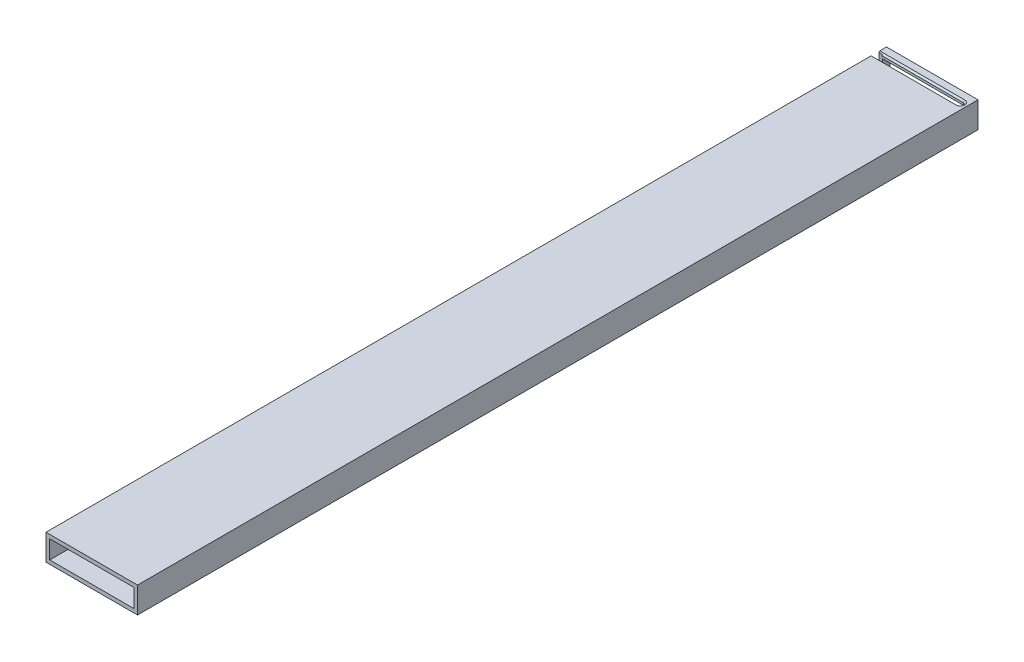
ISO-10303-21;
HEADER;
FILE_DESCRIPTION(('STEP AP214'),'2;1');
FILE_NAME('part.step','',(''),(''),'','','');
FILE_SCHEMA(('AUTOMOTIVE_DESIGN { 1 0 10303 214 1 1 1 1 }'));
ENDSEC;
DATA;
#1=APPLICATION_CONTEXT('core data for automotive mechanical design processes');
#2=APPLICATION_PROTOCOL_DEFINITION('international standard','automotive_design',2000,#1);
#3=PRODUCT_CONTEXT('',#1,'mechanical');
#4=PRODUCT('Part','Part','',(#3));
#5=PRODUCT_RELATED_PRODUCT_CATEGORY('part','',(#4));
#6=PRODUCT_DEFINITION_FORMATION('','',#4);
#7=PRODUCT_DEFINITION_CONTEXT('part definition',#1,'design');
#8=PRODUCT_DEFINITION('design','',#6,#7);
#9=PRODUCT_DEFINITION_SHAPE('','',#8);
#10=(LENGTH_UNIT() NAMED_UNIT(*) SI_UNIT(.MILLI.,.METRE.));
#11=(NAMED_UNIT(*) PLANE_ANGLE_UNIT() SI_UNIT($,.RADIAN.));
#12=(NAMED_UNIT(*) SI_UNIT($,.STERADIAN.) SOLID_ANGLE_UNIT());
#13=UNCERTAINTY_MEASURE_WITH_UNIT(LENGTH_MEASURE(1.E-05),#10,'distance_accuracy_value','');
#14=(GEOMETRIC_REPRESENTATION_CONTEXT(3) GLOBAL_UNCERTAINTY_ASSIGNED_CONTEXT((#13)) GLOBAL_UNIT_ASSIGNED_CONTEXT((#10,
#11,#12)) REPRESENTATION_CONTEXT('',''));
#15=CARTESIAN_POINT('',(0.,0.,0.));
#16=DIRECTION('',(0.,0.,1.));
#17=DIRECTION('',(1.,0.,0.));
#18=AXIS2_PLACEMENT_3D('',#15,#16,#17);
#19=CARTESIAN_POINT('',(-16.5,3.6,330.));
#20=DIRECTION('',(0.,-1.,0.));
#21=DIRECTION('',(0.,0.,-1.));
#22=AXIS2_PLACEMENT_3D('',#19,#20,#21);
#23=PLANE('',#22);
#24=DIRECTION('',(0.,0.,-1.));
#25=VECTOR('',#24,1.);
#26=CARTESIAN_POINT('',(-16.5,3.6,0.));
#27=LINE('',#26,#25);
#28=CARTESIAN_POINT('',(-16.5,3.6,3.24999999999998));
#29=VERTEX_POINT('',#28);
#30=CARTESIAN_POINT('',(-16.5,3.6,3.));
#31=VERTEX_POINT('',#30);
#32=EDGE_CURVE('E218',#29,#31,#27,.T.);
#33=ORIENTED_EDGE('',*,*,#32,.T.);
#34=DIRECTION('',(0.,0.,-1.));
#35=VECTOR('',#34,1.);
#36=CARTESIAN_POINT('',(-16.5,3.6,330.));
#37=LINE('',#36,#35);
#38=CARTESIAN_POINT('',(-16.5,3.6,0.));
#39=VERTEX_POINT('',#38);
#40=EDGE_CURVE('E288',#31,#39,#37,.T.);
#41=ORIENTED_EDGE('',*,*,#40,.T.);
#42=DIRECTION('',(-1.,0.,0.));
#43=VECTOR('',#42,1.);
#44=CARTESIAN_POINT('',(-16.5,3.6,0.));
#45=LINE('',#44,#43);
#46=CARTESIAN_POINT('',(16.5,3.6,0.));
#47=VERTEX_POINT('',#46);
#48=EDGE_CURVE('E271',#47,#39,#45,.T.);
#49=ORIENTED_EDGE('',*,*,#48,.F.);
#50=DIRECTION('',(0.,0.,-1.));
#51=VECTOR('',#50,1.);
#52=CARTESIAN_POINT('',(16.5,3.6,330.));
#53=LINE('',#52,#51);
#54=CARTESIAN_POINT('',(16.5,3.6,4.35000000000002));
#55=VERTEX_POINT('',#54);
#56=EDGE_CURVE('E204',#55,#47,#53,.T.);
#57=ORIENTED_EDGE('',*,*,#56,.F.);
#58=CARTESIAN_POINT('',(15.4,3.6,4.35000000000002));
#59=DIRECTION('',(0.,-1.,0.));
#60=DIRECTION('',(0.,0.,-1.));
#61=AXIS2_PLACEMENT_3D('',#58,#59,#60);
#62=CIRCLE('',#61,1.10000000000002);
#63=CARTESIAN_POINT('',(15.4,3.6,3.24999999999998));
#64=VERTEX_POINT('',#63);
#65=EDGE_CURVE('E190',#55,#64,#62,.F.);
#66=ORIENTED_EDGE('',*,*,#65,.T.);
#67=DIRECTION('',(1.,0.,0.));
#68=VECTOR('',#67,1.);
#69=CARTESIAN_POINT('',(0.,3.6,3.24999999999998));
#70=LINE('',#69,#68);
#71=EDGE_CURVE('E179',#29,#64,#70,.T.);
#72=ORIENTED_EDGE('',*,*,#71,.F.);
#73=EDGE_LOOP('',(#33,#41,#49,#57,#66,#72));
#74=FACE_BOUND('',#73,.T.);
#75=ADVANCED_FACE('F40',(#74),#23,.T.);
#76=CARTESIAN_POINT('',(-17.9659090909091,5.10000000000001,330.));
#77=DIRECTION('',(1.,0.,0.));
#78=DIRECTION('',(0.,0.,-1.));
#79=AXIS2_PLACEMENT_3D('',#76,#77,#78);
#80=PLANE('',#79);
#81=DIRECTION('',(0.,-1.,0.));
#82=VECTOR('',#81,1.);
#83=CARTESIAN_POINT('',(-17.9659090909091,0.,3.));
#84=LINE('',#83,#82);
#85=CARTESIAN_POINT('',(-17.9659090909091,4.75000000000003,3.));
#86=VERTEX_POINT('',#85);
#87=CARTESIAN_POINT('',(-17.9659090909091,0.399999999999996,3.));
#88=VERTEX_POINT('',#87);
#89=EDGE_CURVE('E237',#86,#88,#84,.T.);
#90=ORIENTED_EDGE('',*,*,#89,.F.);
#91=DIRECTION('',(0.,0.707106781186563,-0.707106781186532));
#92=VECTOR('',#91,1.);
#93=CARTESIAN_POINT('',(-17.9659090909091,5.10000000000001,2.65000000000004));
#94=LINE('',#93,#92);
#95=CARTESIAN_POINT('',(-17.9659090909091,5.10000000000001,2.65000000000004));
#96=VERTEX_POINT('',#95);
#97=EDGE_CURVE('E373',#86,#96,#94,.T.);
#98=ORIENTED_EDGE('',*,*,#97,.T.);
#99=DIRECTION('',(0.,0.,-1.));
#100=VECTOR('',#99,1.);
#101=CARTESIAN_POINT('',(-17.9659090909091,5.10000000000001,330.));
#102=LINE('',#101,#100);
#103=CARTESIAN_POINT('',(-17.9659090909091,5.10000000000001,0.));
#104=VERTEX_POINT('',#103);
#105=EDGE_CURVE('E331',#96,#104,#102,.T.);
#106=ORIENTED_EDGE('',*,*,#105,.T.);
#107=DIRECTION('',(0.,-1.,0.));
#108=VECTOR('',#107,1.);
#109=CARTESIAN_POINT('',(-17.9659090909091,5.10000000000001,0.));
#110=LINE('',#109,#108);
#111=CARTESIAN_POINT('',(-17.9659090909091,-5.1,0.));
#112=VERTEX_POINT('',#111);
#113=EDGE_CURVE('E319',#104,#112,#110,.T.);
#114=ORIENTED_EDGE('',*,*,#113,.T.);
#115=DIRECTION('',(0.,0.,-1.));
#116=VECTOR('',#115,1.);
#117=CARTESIAN_POINT('',(-17.9659090909091,-5.1,330.));
#118=LINE('',#117,#116);
#119=CARTESIAN_POINT('',(-17.9659090909091,-5.1,330.));
#120=VERTEX_POINT('',#119);
#121=EDGE_CURVE('E327',#120,#112,#118,.T.);
#122=ORIENTED_EDGE('',*,*,#121,.F.);
#123=DIRECTION('',(0.,-1.,0.));
#124=VECTOR('',#123,1.);
#125=CARTESIAN_POINT('',(-17.9659090909091,5.10000000000001,330.));
#126=LINE('',#125,#124);
#127=CARTESIAN_POINT('',(-17.9659090909091,5.10000000000001,330.));
#128=VERTEX_POINT('',#127);
#129=EDGE_CURVE('E305',#128,#120,#126,.T.);
#130=ORIENTED_EDGE('',*,*,#129,.F.);
#131=CARTESIAN_POINT('',(-17.9659090909091,5.10000000000001,6.05000000000006));
#132=VERTEX_POINT('',#131);
#133=EDGE_CURVE('E332',#128,#132,#102,.T.);
#134=ORIENTED_EDGE('',*,*,#133,.T.);
#135=DIRECTION('',(0.,-0.707106781186523,-0.707106781186572));
#136=VECTOR('',#135,1.);
#137=CARTESIAN_POINT('',(-17.9659090909091,5.10000000000001,6.05000000000006));
#138=LINE('',#137,#136);
#139=CARTESIAN_POINT('',(-17.9659090909091,4.74999999999998,5.7));
#140=VERTEX_POINT('',#139);
#141=EDGE_CURVE('E370',#132,#140,#138,.T.);
#142=ORIENTED_EDGE('',*,*,#141,.T.);
#143=DIRECTION('',(0.,-1.,0.));
#144=VECTOR('',#143,1.);
#145=CARTESIAN_POINT('',(-17.9659090909091,0.,5.7));
#146=LINE('',#145,#144);
#147=CARTESIAN_POINT('',(-17.9659090909091,0.399999999999998,5.69999999999998));
#148=VERTEX_POINT('',#147);
#149=EDGE_CURVE('E234',#140,#148,#146,.T.);
#150=ORIENTED_EDGE('',*,*,#149,.T.);
#151=DIRECTION('',(0.,0.,1.));
#152=VECTOR('',#151,1.);
#153=CARTESIAN_POINT('',(-17.9659090909091,0.399999999999994,0.));
#154=LINE('',#153,#152);
#155=EDGE_CURVE('E240',#88,#148,#154,.T.);
#156=ORIENTED_EDGE('',*,*,#155,.F.);
#157=EDGE_LOOP('',(#90,#98,#106,#114,#122,#130,#134,#142,#150,#156));
#158=FACE_BOUND('',#157,.T.);
#159=ADVANCED_FACE('F403',(#158),#80,.F.);
#160=CARTESIAN_POINT('',(0.,0.,330.));
#161=DIRECTION('',(0.,0.,1.));
#162=DIRECTION('',(1.,0.,0.));
#163=AXIS2_PLACEMENT_3D('',#160,#161,#162);
#164=PLANE('',#163);
#165=DIRECTION('',(0.,1.,0.));
#166=VECTOR('',#165,1.);
#167=CARTESIAN_POINT('',(17.9659090909091,5.10000000000001,330.));
#168=LINE('',#167,#166);
#169=CARTESIAN_POINT('',(17.9659090909091,-5.1,330.));
#170=VERTEX_POINT('',#169);
#171=CARTESIAN_POINT('',(17.9659090909091,5.10000000000001,330.));
#172=VERTEX_POINT('',#171);
#173=EDGE_CURVE('E297',#170,#172,#168,.T.);
#174=ORIENTED_EDGE('',*,*,#173,.T.);
#175=DIRECTION('',(-1.,0.,0.));
#176=VECTOR('',#175,1.);
#177=CARTESIAN_POINT('',(-17.9659090909091,5.10000000000001,330.));
#178=LINE('',#177,#176);
#179=EDGE_CURVE('E301',#172,#128,#178,.T.);
#180=ORIENTED_EDGE('',*,*,#179,.T.);
#181=ORIENTED_EDGE('',*,*,#129,.T.);
#182=DIRECTION('',(1.,0.,0.));
#183=VECTOR('',#182,1.);
#184=CARTESIAN_POINT('',(-17.9659090909091,-5.1,330.));
#185=LINE('',#184,#183);
#186=EDGE_CURVE('E308',#120,#170,#185,.T.);
#187=ORIENTED_EDGE('',*,*,#186,.T.);
#188=EDGE_LOOP('',(#174,#180,#181,#187));
#189=FACE_BOUND('',#188,.T.);
#190=DIRECTION('',(-1.,0.,0.));
#191=VECTOR('',#190,1.);
#192=CARTESIAN_POINT('',(-16.5,3.6,330.));
#193=LINE('',#192,#191);
#194=CARTESIAN_POINT('',(16.5,3.6,330.));
#195=VERTEX_POINT('',#194);
#196=CARTESIAN_POINT('',(-16.5,3.6,330.));
#197=VERTEX_POINT('',#196);
#198=EDGE_CURVE('E256',#195,#197,#193,.T.);
#199=ORIENTED_EDGE('',*,*,#198,.F.);
#200=DIRECTION('',(0.,1.,0.));
#201=VECTOR('',#200,1.);
#202=CARTESIAN_POINT('',(16.5,3.6,330.));
#203=LINE('',#202,#201);
#204=CARTESIAN_POINT('',(16.5,-3.6,330.));
#205=VERTEX_POINT('',#204);
#206=EDGE_CURVE('E253',#205,#195,#203,.T.);
#207=ORIENTED_EDGE('',*,*,#206,.F.);
#208=DIRECTION('',(1.,0.,0.));
#209=VECTOR('',#208,1.);
#210=CARTESIAN_POINT('',(-16.5,-3.6,330.));
#211=LINE('',#210,#209);
#212=CARTESIAN_POINT('',(-16.5,-3.6,330.));
#213=VERTEX_POINT('',#212);
#214=EDGE_CURVE('E264',#213,#205,#211,.T.);
#215=ORIENTED_EDGE('',*,*,#214,.F.);
#216=DIRECTION('',(0.,-1.,0.));
#217=VECTOR('',#216,1.);
#218=CARTESIAN_POINT('',(-16.5,3.6,330.));
#219=LINE('',#218,#217);
#220=EDGE_CURVE('E260',#197,#213,#219,.T.);
#221=ORIENTED_EDGE('',*,*,#220,.F.);
#222=EDGE_LOOP('',(#199,#207,#215,#221));
#223=FACE_BOUND('',#222,.T.);
#224=ADVANCED_FACE('F407',(#189,#223),#164,.T.);
#225=CARTESIAN_POINT('',(0.,0.,0.));
#226=DIRECTION('',(0.,0.,1.));
#227=DIRECTION('',(1.,0.,0.));
#228=AXIS2_PLACEMENT_3D('',#225,#226,#227);
#229=PLANE('',#228);
#230=DIRECTION('',(0.,1.,0.));
#231=VECTOR('',#230,1.);
#232=CARTESIAN_POINT('',(17.9659090909091,5.10000000000001,0.));
#233=LINE('',#232,#231);
#234=CARTESIAN_POINT('',(17.9659090909091,-5.1,0.));
#235=VERTEX_POINT('',#234);
#236=CARTESIAN_POINT('',(17.9659090909091,5.10000000000001,0.));
#237=VERTEX_POINT('',#236);
#238=EDGE_CURVE('E296',#235,#237,#233,.T.);
#239=ORIENTED_EDGE('',*,*,#238,.F.);
#240=DIRECTION('',(1.,0.,0.));
#241=VECTOR('',#240,1.);
#242=CARTESIAN_POINT('',(-17.9659090909091,-5.1,0.));
#243=LINE('',#242,#241);
#244=EDGE_CURVE('E302',#112,#235,#243,.T.);
#245=ORIENTED_EDGE('',*,*,#244,.F.);
#246=ORIENTED_EDGE('',*,*,#113,.F.);
#247=DIRECTION('',(-1.,0.,0.));
#248=VECTOR('',#247,1.);
#249=CARTESIAN_POINT('',(-17.9659090909091,5.10000000000001,0.));
#250=LINE('',#249,#248);
#251=EDGE_CURVE('E315',#237,#104,#250,.T.);
#252=ORIENTED_EDGE('',*,*,#251,.F.);
#253=EDGE_LOOP('',(#239,#245,#246,#252));
#254=FACE_BOUND('',#253,.T.);
#255=DIRECTION('',(0.,1.,0.));
#256=VECTOR('',#255,1.);
#257=CARTESIAN_POINT('',(16.5,3.6,0.));
#258=LINE('',#257,#256);
#259=CARTESIAN_POINT('',(16.5,-3.6,0.));
#260=VERTEX_POINT('',#259);
#261=EDGE_CURVE('E249',#260,#47,#258,.T.);
#262=ORIENTED_EDGE('',*,*,#261,.T.);
#263=ORIENTED_EDGE('',*,*,#48,.T.);
#264=DIRECTION('',(0.,-1.,0.));
#265=VECTOR('',#264,1.);
#266=CARTESIAN_POINT('',(-16.5,3.6,0.));
#267=LINE('',#266,#265);
#268=CARTESIAN_POINT('',(-16.5,-3.6,0.));
#269=VERTEX_POINT('',#268);
#270=EDGE_CURVE('E275',#39,#269,#267,.T.);
#271=ORIENTED_EDGE('',*,*,#270,.T.);
#272=DIRECTION('',(1.,0.,0.));
#273=VECTOR('',#272,1.);
#274=CARTESIAN_POINT('',(-16.5,-3.6,0.));
#275=LINE('',#274,#273);
#276=EDGE_CURVE('E257',#269,#260,#275,.T.);
#277=ORIENTED_EDGE('',*,*,#276,.T.);
#278=EDGE_LOOP('',(#262,#263,#271,#277));
#279=FACE_BOUND('',#278,.T.);
#280=ADVANCED_FACE('F418',(#254,#279),#229,.F.);
#281=CARTESIAN_POINT('',(17.9659090909091,5.10000000000001,330.));
#282=DIRECTION('',(-1.,0.,0.));
#283=DIRECTION('',(0.,-1.,0.));
#284=AXIS2_PLACEMENT_3D('',#281,#282,#283);
#285=PLANE('',#284);
#286=ORIENTED_EDGE('',*,*,#238,.T.);
#287=DIRECTION('',(0.,0.,-1.));
#288=VECTOR('',#287,1.);
#289=CARTESIAN_POINT('',(17.9659090909091,5.10000000000001,330.));
#290=LINE('',#289,#288);
#291=EDGE_CURVE('E336',#172,#237,#290,.T.);
#292=ORIENTED_EDGE('',*,*,#291,.F.);
#293=ORIENTED_EDGE('',*,*,#173,.F.);
#294=DIRECTION('',(0.,0.,-1.));
#295=VECTOR('',#294,1.);
#296=CARTESIAN_POINT('',(17.9659090909091,-5.1,330.));
#297=LINE('',#296,#295);
#298=EDGE_CURVE('E311',#170,#235,#297,.T.);
#299=ORIENTED_EDGE('',*,*,#298,.T.);
#300=EDGE_LOOP('',(#286,#292,#293,#299));
#301=FACE_BOUND('',#300,.T.);
#302=ADVANCED_FACE('F415',(#301),#285,.F.);
#303=CARTESIAN_POINT('',(-17.9659090909091,5.10000000000001,330.));
#304=DIRECTION('',(0.,-1.,0.));
#305=DIRECTION('',(0.,0.,-1.));
#306=AXIS2_PLACEMENT_3D('',#303,#304,#305);
#307=PLANE('',#306);
#308=ORIENTED_EDGE('',*,*,#105,.F.);
#309=DIRECTION('',(1.,0.,0.));
#310=VECTOR('',#309,1.);
#311=CARTESIAN_POINT('',(15.4,5.10000000000001,2.65000000000005));
#312=LINE('',#311,#310);
#313=CARTESIAN_POINT('',(15.4,5.10000000000001,2.64999999999998));
#314=VERTEX_POINT('',#313);
#315=EDGE_CURVE('E357',#96,#314,#312,.T.);
#316=ORIENTED_EDGE('',*,*,#315,.T.);
#317=CARTESIAN_POINT('',(15.4,5.10000000000001,4.35000000000002));
#318=DIRECTION('',(0.,-1.,0.));
#319=DIRECTION('',(0.,0.,-1.));
#320=AXIS2_PLACEMENT_3D('',#317,#318,#319);
#321=CIRCLE('',#320,1.70000000000004);
#322=CARTESIAN_POINT('',(15.4,5.10000000000001,6.05000000000005));
#323=VERTEX_POINT('',#322);
#324=EDGE_CURVE('E354',#314,#323,#321,.T.);
#325=ORIENTED_EDGE('',*,*,#324,.T.);
#326=DIRECTION('',(-1.,0.,0.));
#327=VECTOR('',#326,1.);
#328=CARTESIAN_POINT('',(-16.5,5.10000000000001,6.05000000000006));
#329=LINE('',#328,#327);
#330=EDGE_CURVE('E351',#323,#132,#329,.T.);
#331=ORIENTED_EDGE('',*,*,#330,.T.);
#332=ORIENTED_EDGE('',*,*,#133,.F.);
#333=ORIENTED_EDGE('',*,*,#179,.F.);
#334=ORIENTED_EDGE('',*,*,#291,.T.);
#335=ORIENTED_EDGE('',*,*,#251,.T.);
#336=EDGE_LOOP('',(#308,#316,#325,#331,#332,#333,#334,#335));
#337=FACE_BOUND('',#336,.T.);
#338=ADVANCED_FACE('F399',(#337),#307,.F.);
#339=CARTESIAN_POINT('',(-17.9659090909091,-5.1,330.));
#340=DIRECTION('',(0.,1.,0.));
#341=DIRECTION('',(-1.,0.,0.));
#342=AXIS2_PLACEMENT_3D('',#339,#340,#341);
#343=PLANE('',#342);
#344=ORIENTED_EDGE('',*,*,#244,.T.);
#345=ORIENTED_EDGE('',*,*,#298,.F.);
#346=ORIENTED_EDGE('',*,*,#186,.F.);
#347=ORIENTED_EDGE('',*,*,#121,.T.);
#348=EDGE_LOOP('',(#344,#345,#346,#347));
#349=FACE_BOUND('',#348,.T.);
#350=ADVANCED_FACE('F421',(#349),#343,.F.);
#351=CARTESIAN_POINT('',(16.5,3.6,330.));
#352=DIRECTION('',(-1.,0.,0.));
#353=DIRECTION('',(0.,-1.,0.));
#354=AXIS2_PLACEMENT_3D('',#351,#352,#353);
#355=PLANE('',#354);
#356=EDGE_CURVE('E293',#195,#55,#53,.T.);
#357=ORIENTED_EDGE('',*,*,#356,.T.);
#358=ORIENTED_EDGE('',*,*,#56,.T.);
#359=ORIENTED_EDGE('',*,*,#261,.F.);
#360=DIRECTION('',(0.,0.,-1.));
#361=VECTOR('',#360,1.);
#362=CARTESIAN_POINT('',(16.5,-3.6,330.));
#363=LINE('',#362,#361);
#364=EDGE_CURVE('E267',#205,#260,#363,.T.);
#365=ORIENTED_EDGE('',*,*,#364,.F.);
#366=ORIENTED_EDGE('',*,*,#206,.T.);
#367=EDGE_LOOP('',(#357,#358,#359,#365,#366));
#368=FACE_BOUND('',#367,.T.);
#369=ADVANCED_FACE('F423',(#368),#355,.T.);
#370=CARTESIAN_POINT('',(15.4,3.6,5.45000000000004));
#371=VERTEX_POINT('',#370);
#372=EDGE_CURVE('E200',#371,#55,#62,.F.);
#373=ORIENTED_EDGE('',*,*,#372,.T.);
#374=ORIENTED_EDGE('',*,*,#356,.F.);
#375=ORIENTED_EDGE('',*,*,#198,.T.);
#376=CARTESIAN_POINT('',(-16.5,3.6,5.69999999999998));
#377=VERTEX_POINT('',#376);
#378=EDGE_CURVE('E289',#197,#377,#37,.T.);
#379=ORIENTED_EDGE('',*,*,#378,.T.);
#380=DIRECTION('',(0.,0.,-1.));
#381=VECTOR('',#380,1.);
#382=CARTESIAN_POINT('',(-16.5,3.6,0.));
#383=LINE('',#382,#381);
#384=CARTESIAN_POINT('',(-16.5,3.6,5.45000000000002));
#385=VERTEX_POINT('',#384);
#386=EDGE_CURVE('E212',#377,#385,#383,.T.);
#387=ORIENTED_EDGE('',*,*,#386,.T.);
#388=DIRECTION('',(-1.,0.,0.));
#389=VECTOR('',#388,1.);
#390=CARTESIAN_POINT('',(0.,3.6,5.45000000000002));
#391=LINE('',#390,#389);
#392=EDGE_CURVE('E191',#371,#385,#391,.T.);
#393=ORIENTED_EDGE('',*,*,#392,.F.);
#394=EDGE_LOOP('',(#373,#374,#375,#379,#387,#393));
#395=FACE_BOUND('',#394,.T.);
#396=ADVANCED_FACE('F429',(#395),#23,.T.);
#397=CARTESIAN_POINT('',(-16.5,3.6,330.));
#398=DIRECTION('',(1.,0.,0.));
#399=DIRECTION('',(0.,1.,0.));
#400=AXIS2_PLACEMENT_3D('',#397,#398,#399);
#401=PLANE('',#400);
#402=DIRECTION('',(0.,1.,0.));
#403=VECTOR('',#402,1.);
#404=CARTESIAN_POINT('',(-16.5,3.6,3.));
#405=LINE('',#404,#403);
#406=CARTESIAN_POINT('',(-16.5,0.399999999999996,3.));
#407=VERTEX_POINT('',#406);
#408=EDGE_CURVE('E347',#407,#31,#405,.T.);
#409=ORIENTED_EDGE('',*,*,#408,.F.);
#410=DIRECTION('',(0.,0.,-1.));
#411=VECTOR('',#410,1.);
#412=CARTESIAN_POINT('',(-16.5,0.400000000000259,330.));
#413=LINE('',#412,#411);
#414=CARTESIAN_POINT('',(-16.5,0.399999999999998,5.7));
#415=VERTEX_POINT('',#414);
#416=EDGE_CURVE('E344',#415,#407,#413,.T.);
#417=ORIENTED_EDGE('',*,*,#416,.F.);
#418=DIRECTION('',(0.,1.,0.));
#419=VECTOR('',#418,1.);
#420=CARTESIAN_POINT('',(-16.5,3.6,5.69999999999998));
#421=LINE('',#420,#419);
#422=EDGE_CURVE('E340',#415,#377,#421,.T.);
#423=ORIENTED_EDGE('',*,*,#422,.T.);
#424=ORIENTED_EDGE('',*,*,#378,.F.);
#425=ORIENTED_EDGE('',*,*,#220,.T.);
#426=DIRECTION('',(0.,0.,-1.));
#427=VECTOR('',#426,1.);
#428=CARTESIAN_POINT('',(-16.5,-3.6,330.));
#429=LINE('',#428,#427);
#430=EDGE_CURVE('E285',#213,#269,#429,.T.);
#431=ORIENTED_EDGE('',*,*,#430,.T.);
#432=ORIENTED_EDGE('',*,*,#270,.F.);
#433=ORIENTED_EDGE('',*,*,#40,.F.);
#434=EDGE_LOOP('',(#409,#417,#423,#424,#425,#431,#432,#433));
#435=FACE_BOUND('',#434,.T.);
#436=ADVANCED_FACE('F444',(#435),#401,.T.);
#437=CARTESIAN_POINT('',(-16.5,-3.6,330.));
#438=DIRECTION('',(0.,1.,0.));
#439=DIRECTION('',(0.,0.,1.));
#440=AXIS2_PLACEMENT_3D('',#437,#438,#439);
#441=PLANE('',#440);
#442=ORIENTED_EDGE('',*,*,#276,.F.);
#443=ORIENTED_EDGE('',*,*,#430,.F.);
#444=ORIENTED_EDGE('',*,*,#214,.T.);
#445=ORIENTED_EDGE('',*,*,#364,.T.);
#446=EDGE_LOOP('',(#442,#443,#444,#445));
#447=FACE_BOUND('',#446,.T.);
#448=ADVANCED_FACE('F449',(#447),#441,.T.);
#449=CARTESIAN_POINT('',(20.6868842830917,0.,3.));
#450=DIRECTION('',(0.,0.,-1.));
#451=DIRECTION('',(-1.,0.,0.));
#452=AXIS2_PLACEMENT_3D('',#449,#450,#451);
#453=PLANE('',#452);
#454=DIRECTION('',(0.,1.,0.));
#455=VECTOR('',#454,1.);
#456=CARTESIAN_POINT('',(-16.5,-30.9715040092677,3.));
#457=LINE('',#456,#455);
#458=CARTESIAN_POINT('',(-16.5,4.75000000000003,3.));
#459=VERTEX_POINT('',#458);
#460=EDGE_CURVE('E220',#31,#459,#457,.T.);
#461=ORIENTED_EDGE('',*,*,#460,.T.);
#462=DIRECTION('',(-1.,0.,0.));
#463=VECTOR('',#462,1.);
#464=CARTESIAN_POINT('',(-17.9659090909091,4.75000000000003,3.));
#465=LINE('',#464,#463);
#466=EDGE_CURVE('E367',#459,#86,#465,.T.);
#467=ORIENTED_EDGE('',*,*,#466,.T.);
#468=ORIENTED_EDGE('',*,*,#89,.T.);
#469=DIRECTION('',(-1.,0.,0.));
#470=VECTOR('',#469,1.);
#471=CARTESIAN_POINT('',(20.6868842830917,0.399999999999996,3.));
#472=LINE('',#471,#470);
#473=EDGE_CURVE('E244',#407,#88,#472,.T.);
#474=ORIENTED_EDGE('',*,*,#473,.F.);
#475=ORIENTED_EDGE('',*,*,#408,.T.);
#476=EDGE_LOOP('',(#461,#467,#468,#474,#475));
#477=FACE_BOUND('',#476,.T.);
#478=ADVANCED_FACE('F476',(#477),#453,.F.);
#479=CARTESIAN_POINT('',(20.6868842830917,0.399999999999994,0.));
#480=DIRECTION('',(0.,-1.,0.));
#481=DIRECTION('',(0.,0.,-1.));
#482=AXIS2_PLACEMENT_3D('',#479,#480,#481);
#483=PLANE('',#482);
#484=ORIENTED_EDGE('',*,*,#416,.T.);
#485=ORIENTED_EDGE('',*,*,#473,.T.);
#486=ORIENTED_EDGE('',*,*,#155,.T.);
#487=DIRECTION('',(-1.,0.,0.));
#488=VECTOR('',#487,1.);
#489=CARTESIAN_POINT('',(20.6868842830917,0.399999999999998,5.7));
#490=LINE('',#489,#488);
#491=EDGE_CURVE('E245',#415,#148,#490,.T.);
#492=ORIENTED_EDGE('',*,*,#491,.F.);
#493=EDGE_LOOP('',(#484,#485,#486,#492));
#494=FACE_BOUND('',#493,.T.);
#495=ADVANCED_FACE('F480',(#494),#483,.F.);
#496=CARTESIAN_POINT('',(20.6868842830917,0.,5.7));
#497=DIRECTION('',(0.,0.,-1.));
#498=DIRECTION('',(-1.,0.,0.));
#499=AXIS2_PLACEMENT_3D('',#496,#497,#498);
#500=PLANE('',#499);
#501=ORIENTED_EDGE('',*,*,#149,.F.);
#502=DIRECTION('',(1.,0.,0.));
#503=VECTOR('',#502,1.);
#504=CARTESIAN_POINT('',(20.6868842830917,4.74999999999998,5.7));
#505=LINE('',#504,#503);
#506=CARTESIAN_POINT('',(-16.5,4.74999999999998,5.7));
#507=VERTEX_POINT('',#506);
#508=EDGE_CURVE('E66',#140,#507,#505,.T.);
#509=ORIENTED_EDGE('',*,*,#508,.T.);
#510=DIRECTION('',(0.,1.,0.));
#511=VECTOR('',#510,1.);
#512=CARTESIAN_POINT('',(-16.5,-30.9715040092677,5.7));
#513=LINE('',#512,#511);
#514=EDGE_CURVE('E217',#377,#507,#513,.T.);
#515=ORIENTED_EDGE('',*,*,#514,.F.);
#516=ORIENTED_EDGE('',*,*,#422,.F.);
#517=ORIENTED_EDGE('',*,*,#491,.T.);
#518=EDGE_LOOP('',(#501,#509,#515,#516,#517));
#519=FACE_BOUND('',#518,.T.);
#520=ADVANCED_FACE('F483',(#519),#500,.T.);
#521=CARTESIAN_POINT('',(15.4,-30.9715040092677,4.35000000000002));
#522=DIRECTION('',(0.,1.,0.));
#523=DIRECTION('',(0.,0.,1.));
#524=AXIS2_PLACEMENT_3D('',#521,#522,#523);
#525=CYLINDRICAL_SURFACE('',#524,1.10000000000002);
#526=DIRECTION('',(0.,1.,0.));
#527=VECTOR('',#526,1.);
#528=CARTESIAN_POINT('',(15.4,-30.9715040092677,5.45000000000002));
#529=LINE('',#528,#527);
#530=CARTESIAN_POINT('',(15.4,4.50000000000002,5.45000000000002));
#531=VERTEX_POINT('',#530);
#532=EDGE_CURVE('E224',#371,#531,#529,.T.);
#533=ORIENTED_EDGE('',*,*,#532,.T.);
#534=CARTESIAN_POINT('',(15.4,4.50000000000002,4.35000000000002));
#535=DIRECTION('',(0.,-1.,0.));
#536=DIRECTION('',(0.,0.,-1.));
#537=AXIS2_PLACEMENT_3D('',#534,#535,#536);
#538=CIRCLE('',#537,1.10000000000002);
#539=CARTESIAN_POINT('',(15.4,4.50000000000002,3.24999999999998));
#540=VERTEX_POINT('',#539);
#541=EDGE_CURVE('E198',#531,#540,#538,.F.);
#542=ORIENTED_EDGE('',*,*,#541,.T.);
#543=DIRECTION('',(0.,1.,0.));
#544=VECTOR('',#543,1.);
#545=CARTESIAN_POINT('',(15.4,-30.9715040092677,3.24999999999998));
#546=LINE('',#545,#544);
#547=EDGE_CURVE('E182',#64,#540,#546,.T.);
#548=ORIENTED_EDGE('',*,*,#547,.F.);
#549=ORIENTED_EDGE('',*,*,#65,.F.);
#550=ORIENTED_EDGE('',*,*,#372,.F.);
#551=EDGE_LOOP('',(#533,#542,#548,#549,#550));
#552=FACE_BOUND('',#551,.T.);
#553=ADVANCED_FACE('F195',(#552),#525,.F.);
#554=CARTESIAN_POINT('',(0.,-30.9715040092677,3.24999999999998));
#555=DIRECTION('',(0.,0.,1.));
#556=DIRECTION('',(1.,0.,0.));
#557=AXIS2_PLACEMENT_3D('',#554,#555,#556);
#558=PLANE('',#557);
#559=ORIENTED_EDGE('',*,*,#547,.T.);
#560=DIRECTION('',(-1.,0.,0.));
#561=VECTOR('',#560,1.);
#562=CARTESIAN_POINT('',(-16.5,4.50000000000005,3.24999999999998));
#563=LINE('',#562,#561);
#564=CARTESIAN_POINT('',(-16.5,4.50000000000005,3.24999999999998));
#565=VERTEX_POINT('',#564);
#566=EDGE_CURVE('E361',#540,#565,#563,.T.);
#567=ORIENTED_EDGE('',*,*,#566,.T.);
#568=DIRECTION('',(0.,1.,0.));
#569=VECTOR('',#568,1.);
#570=CARTESIAN_POINT('',(-16.5,-30.9715040092677,3.24999999999998));
#571=LINE('',#570,#569);
#572=EDGE_CURVE('E185',#29,#565,#571,.T.);
#573=ORIENTED_EDGE('',*,*,#572,.F.);
#574=ORIENTED_EDGE('',*,*,#71,.T.);
#575=EDGE_LOOP('',(#559,#567,#573,#574));
#576=FACE_BOUND('',#575,.T.);
#577=ADVANCED_FACE('F181',(#576),#558,.T.);
#578=CARTESIAN_POINT('',(-16.5,-30.9715040092677,0.));
#579=DIRECTION('',(1.,0.,0.));
#580=DIRECTION('',(0.,0.,-1.));
#581=AXIS2_PLACEMENT_3D('',#578,#579,#580);
#582=PLANE('',#581);
#583=ORIENTED_EDGE('',*,*,#572,.T.);
#584=DIRECTION('',(0.,0.707106781186563,-0.707106781186532));
#585=VECTOR('',#584,1.);
#586=CARTESIAN_POINT('',(-16.5,5.10000000000001,2.65000000000004));
#587=LINE('',#586,#585);
#588=EDGE_CURVE('E364',#565,#459,#587,.T.);
#589=ORIENTED_EDGE('',*,*,#588,.T.);
#590=ORIENTED_EDGE('',*,*,#460,.F.);
#591=ORIENTED_EDGE('',*,*,#32,.F.);
#592=EDGE_LOOP('',(#583,#589,#590,#591));
#593=FACE_BOUND('',#592,.T.);
#594=ADVANCED_FACE('F592',(#593),#582,.F.);
#595=CARTESIAN_POINT('',(-16.5,-30.9715040092677,0.));
#596=DIRECTION('',(1.,0.,0.));
#597=DIRECTION('',(0.,0.,-1.));
#598=AXIS2_PLACEMENT_3D('',#595,#596,#597);
#599=PLANE('',#598);
#600=ORIENTED_EDGE('',*,*,#514,.T.);
#601=DIRECTION('',(0.,-0.707106781186523,-0.707106781186572));
#602=VECTOR('',#601,1.);
#603=CARTESIAN_POINT('',(-16.5,5.10000000000001,6.05000000000006));
#604=LINE('',#603,#602);
#605=CARTESIAN_POINT('',(-16.5,4.50000000000002,5.45000000000002));
#606=VERTEX_POINT('',#605);
#607=EDGE_CURVE('E51',#507,#606,#604,.T.);
#608=ORIENTED_EDGE('',*,*,#607,.T.);
#609=DIRECTION('',(0.,1.,0.));
#610=VECTOR('',#609,1.);
#611=CARTESIAN_POINT('',(-16.5,-30.9715040092677,5.45000000000002));
#612=LINE('',#611,#610);
#613=EDGE_CURVE('E216',#385,#606,#612,.T.);
#614=ORIENTED_EDGE('',*,*,#613,.F.);
#615=ORIENTED_EDGE('',*,*,#386,.F.);
#616=EDGE_LOOP('',(#600,#608,#614,#615));
#617=FACE_BOUND('',#616,.T.);
#618=ADVANCED_FACE('F458',(#617),#599,.F.);
#619=CARTESIAN_POINT('',(0.,-30.9715040092677,5.45000000000002));
#620=DIRECTION('',(0.,0.,-1.));
#621=DIRECTION('',(-1.,0.,0.));
#622=AXIS2_PLACEMENT_3D('',#619,#620,#621);
#623=PLANE('',#622);
#624=ORIENTED_EDGE('',*,*,#613,.T.);
#625=DIRECTION('',(1.,0.,0.));
#626=VECTOR('',#625,1.);
#627=CARTESIAN_POINT('',(15.4,4.50000000000002,5.45000000000002));
#628=LINE('',#627,#626);
#629=EDGE_CURVE('E11',#606,#531,#628,.T.);
#630=ORIENTED_EDGE('',*,*,#629,.T.);
#631=ORIENTED_EDGE('',*,*,#532,.F.);
#632=ORIENTED_EDGE('',*,*,#392,.T.);
#633=EDGE_LOOP('',(#624,#630,#631,#632));
#634=FACE_BOUND('',#633,.T.);
#635=ADVANCED_FACE('F456',(#634),#623,.T.);
#636=CARTESIAN_POINT('',(-17.9659090909091,5.10000000000001,6.05000000000006));
#637=DIRECTION('',(0.,0.707106781186572,-0.707106781186523));
#638=DIRECTION('',(1.,0.,0.));
#639=AXIS2_PLACEMENT_3D('',#636,#637,#638);
#640=PLANE('',#639);
#641=ORIENTED_EDGE('',*,*,#141,.F.);
#642=ORIENTED_EDGE('',*,*,#330,.F.);
#643=DIRECTION('',(0.,0.707106781186523,0.707106781186572));
#644=VECTOR('',#643,1.);
#645=CARTESIAN_POINT('',(15.4,4.50000000000002,5.45000000000002));
#646=LINE('',#645,#644);
#647=EDGE_CURVE('E45',#531,#323,#646,.T.);
#648=ORIENTED_EDGE('',*,*,#647,.F.);
#649=ORIENTED_EDGE('',*,*,#629,.F.);
#650=ORIENTED_EDGE('',*,*,#607,.F.);
#651=ORIENTED_EDGE('',*,*,#508,.F.);
#652=EDGE_LOOP('',(#641,#642,#648,#649,#650,#651));
#653=FACE_BOUND('',#652,.T.);
#654=ADVANCED_FACE('F43',(#653),#640,.T.);
#655=CARTESIAN_POINT('',(15.4,4.50000000000002,4.35000000000002));
#656=DIRECTION('',(0.,1.,0.));
#657=DIRECTION('',(0.,0.,1.));
#658=AXIS2_PLACEMENT_3D('',#655,#656,#657);
#659=CONICAL_SURFACE('',#658,1.10000000000002,0.785398163397471);
#660=ORIENTED_EDGE('',*,*,#647,.T.);
#661=ORIENTED_EDGE('',*,*,#324,.F.);
#662=DIRECTION('',(0.,0.707106781186531,-0.707106781186564));
#663=VECTOR('',#662,1.);
#664=CARTESIAN_POINT('',(15.4,4.50000000000002,3.25));
#665=LINE('',#664,#663);
#666=EDGE_CURVE('E381',#540,#314,#665,.T.);
#667=ORIENTED_EDGE('',*,*,#666,.F.);
#668=ORIENTED_EDGE('',*,*,#541,.F.);
#669=EDGE_LOOP('',(#660,#661,#667,#668));
#670=FACE_BOUND('',#669,.T.);
#671=ADVANCED_FACE('F391',(#670),#659,.F.);
#672=CARTESIAN_POINT('',(-17.9659090909091,5.10000000000001,2.65000000000004));
#673=DIRECTION('',(0.,0.707106781186532,0.707106781186563));
#674=DIRECTION('',(-1.,0.,0.));
#675=AXIS2_PLACEMENT_3D('',#672,#673,#674);
#676=PLANE('',#675);
#677=ORIENTED_EDGE('',*,*,#588,.F.);
#678=ORIENTED_EDGE('',*,*,#566,.F.);
#679=ORIENTED_EDGE('',*,*,#666,.T.);
#680=ORIENTED_EDGE('',*,*,#315,.F.);
#681=ORIENTED_EDGE('',*,*,#97,.F.);
#682=ORIENTED_EDGE('',*,*,#466,.F.);
#683=EDGE_LOOP('',(#677,#678,#679,#680,#681,#682));
#684=FACE_BOUND('',#683,.T.);
#685=ADVANCED_FACE('F574',(#684),#676,.T.);
#686=CLOSED_SHELL('',(#75,#159,#224,#280,#302,#338,#350,#369,#396,#436,#448,#478,#495,#520,#553,
#577,#594,#618,#635,#654,#671,#685));
#687=MANIFOLD_SOLID_BREP('B2',#686);
#688=ADVANCED_BREP_SHAPE_REPRESENTATION('',(#18,#687),#14);
#689=SHAPE_DEFINITION_REPRESENTATION(#9,#688);
ENDSEC;
END-ISO-10303-21;
